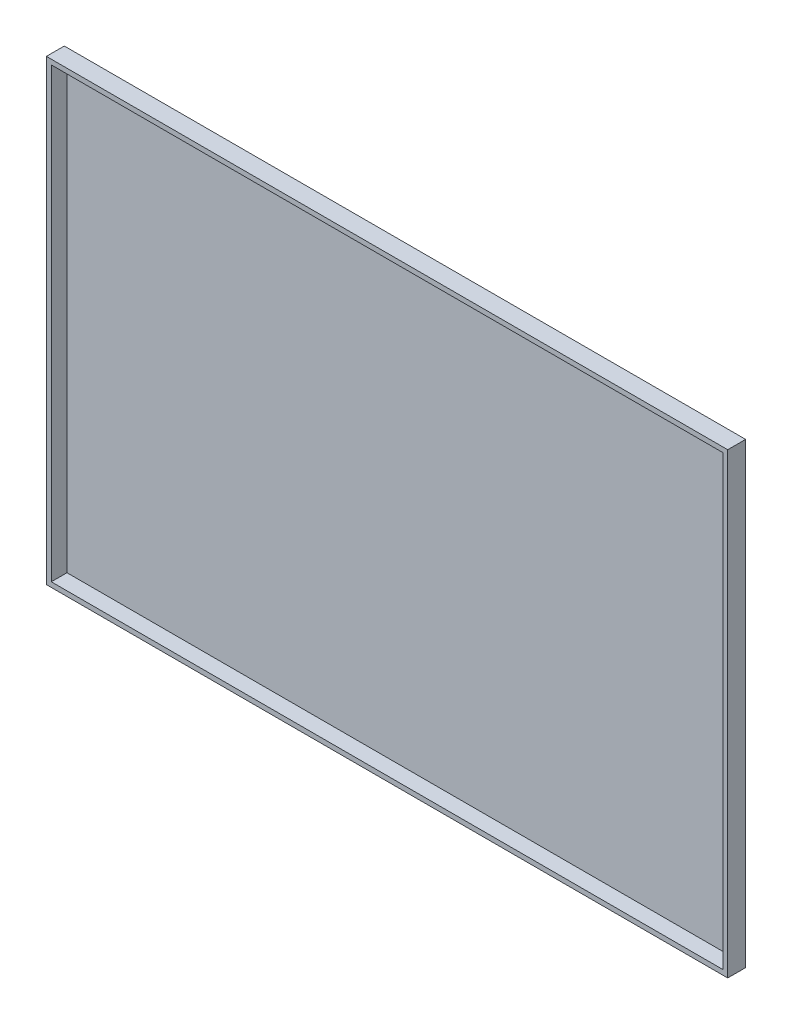
ISO-10303-21;
HEADER;
FILE_DESCRIPTION(('STEP AP214'),'2;1');
FILE_NAME('part.step','',(''),(''),'','','');
FILE_SCHEMA(('AUTOMOTIVE_DESIGN { 1 0 10303 214 1 1 1 1 }'));
ENDSEC;
DATA;
#1=APPLICATION_CONTEXT('core data for automotive mechanical design processes');
#2=APPLICATION_PROTOCOL_DEFINITION('international standard','automotive_design',2000,#1);
#3=PRODUCT_CONTEXT('',#1,'mechanical');
#4=PRODUCT('Part','Part','',(#3));
#5=PRODUCT_RELATED_PRODUCT_CATEGORY('part','',(#4));
#6=PRODUCT_DEFINITION_FORMATION('','',#4);
#7=PRODUCT_DEFINITION_CONTEXT('part definition',#1,'design');
#8=PRODUCT_DEFINITION('design','',#6,#7);
#9=PRODUCT_DEFINITION_SHAPE('','',#8);
#10=(LENGTH_UNIT() NAMED_UNIT(*) SI_UNIT(.MILLI.,.METRE.));
#11=(NAMED_UNIT(*) PLANE_ANGLE_UNIT() SI_UNIT($,.RADIAN.));
#12=(NAMED_UNIT(*) SI_UNIT($,.STERADIAN.) SOLID_ANGLE_UNIT());
#13=UNCERTAINTY_MEASURE_WITH_UNIT(LENGTH_MEASURE(1.E-05),#10,'distance_accuracy_value','');
#14=(GEOMETRIC_REPRESENTATION_CONTEXT(3) GLOBAL_UNCERTAINTY_ASSIGNED_CONTEXT((#13)) GLOBAL_UNIT_ASSIGNED_CONTEXT((#10,
#11,#12)) REPRESENTATION_CONTEXT('',''));
#15=CARTESIAN_POINT('',(0.,0.,0.));
#16=DIRECTION('',(0.,0.,1.));
#17=DIRECTION('',(1.,0.,0.));
#18=AXIS2_PLACEMENT_3D('',#15,#16,#17);
#19=CARTESIAN_POINT('',(1522.,0.,10.));
#20=DIRECTION('',(1.,0.,0.));
#21=DIRECTION('',(0.,0.,-1.));
#22=AXIS2_PLACEMENT_3D('',#19,#20,#21);
#23=PLANE('',#22);
#24=DIRECTION('',(0.,-1.,0.));
#25=VECTOR('',#24,1.);
#26=CARTESIAN_POINT('',(1522.,0.,0.));
#27=LINE('',#26,#25);
#28=CARTESIAN_POINT('',(1522.,1022.,0.));
#29=VERTEX_POINT('',#28);
#30=CARTESIAN_POINT('',(1522.,-1022.,0.));
#31=VERTEX_POINT('',#30);
#32=EDGE_CURVE('E173',#29,#31,#27,.T.);
#33=ORIENTED_EDGE('',*,*,#32,.F.);
#34=DIRECTION('',(0.,0.,-1.));
#35=VECTOR('',#34,1.);
#36=CARTESIAN_POINT('',(1522.,1022.,10.));
#37=LINE('',#36,#35);
#38=CARTESIAN_POINT('',(1522.,1022.,80.));
#39=VERTEX_POINT('',#38);
#40=EDGE_CURVE('E11',#39,#29,#37,.T.);
#41=ORIENTED_EDGE('',*,*,#40,.F.);
#42=DIRECTION('',(0.,1.,0.));
#43=VECTOR('',#42,1.);
#44=CARTESIAN_POINT('',(1522.,1022.,80.));
#45=LINE('',#44,#43);
#46=CARTESIAN_POINT('',(1522.,-1022.,80.));
#47=VERTEX_POINT('',#46);
#48=EDGE_CURVE('E124',#47,#39,#45,.T.);
#49=ORIENTED_EDGE('',*,*,#48,.F.);
#50=DIRECTION('',(0.,0.,-1.));
#51=VECTOR('',#50,1.);
#52=CARTESIAN_POINT('',(1522.,-1022.,10.));
#53=LINE('',#52,#51);
#54=EDGE_CURVE('E188',#47,#31,#53,.T.);
#55=ORIENTED_EDGE('',*,*,#54,.T.);
#56=EDGE_LOOP('',(#33,#41,#49,#55));
#57=FACE_BOUND('',#56,.T.);
#58=ADVANCED_FACE('F44',(#57),#23,.T.);
#59=CARTESIAN_POINT('',(0.,1022.,10.));
#60=DIRECTION('',(0.,1.,0.));
#61=DIRECTION('',(0.,0.,1.));
#62=AXIS2_PLACEMENT_3D('',#59,#60,#61);
#63=PLANE('',#62);
#64=DIRECTION('',(1.,0.,0.));
#65=VECTOR('',#64,1.);
#66=CARTESIAN_POINT('',(0.,1022.,0.));
#67=LINE('',#66,#65);
#68=CARTESIAN_POINT('',(-1522.,1022.,0.));
#69=VERTEX_POINT('',#68);
#70=EDGE_CURVE('E177',#69,#29,#67,.T.);
#71=ORIENTED_EDGE('',*,*,#70,.F.);
#72=DIRECTION('',(0.,0.,-1.));
#73=VECTOR('',#72,1.);
#74=CARTESIAN_POINT('',(-1522.,1022.,10.));
#75=LINE('',#74,#73);
#76=CARTESIAN_POINT('',(-1522.,1022.,80.));
#77=VERTEX_POINT('',#76);
#78=EDGE_CURVE('E52',#77,#69,#75,.T.);
#79=ORIENTED_EDGE('',*,*,#78,.F.);
#80=DIRECTION('',(-1.,0.,0.));
#81=VECTOR('',#80,1.);
#82=CARTESIAN_POINT('',(-1522.,1022.,80.));
#83=LINE('',#82,#81);
#84=EDGE_CURVE('E150',#39,#77,#83,.T.);
#85=ORIENTED_EDGE('',*,*,#84,.F.);
#86=ORIENTED_EDGE('',*,*,#40,.T.);
#87=EDGE_LOOP('',(#71,#79,#85,#86));
#88=FACE_BOUND('',#87,.T.);
#89=ADVANCED_FACE('F205',(#88),#63,.T.);
#90=CARTESIAN_POINT('',(-1522.,0.,10.));
#91=DIRECTION('',(1.,0.,0.));
#92=DIRECTION('',(0.,0.,-1.));
#93=AXIS2_PLACEMENT_3D('',#90,#91,#92);
#94=PLANE('',#93);
#95=DIRECTION('',(0.,-1.,0.));
#96=VECTOR('',#95,1.);
#97=CARTESIAN_POINT('',(-1522.,0.,0.));
#98=LINE('',#97,#96);
#99=CARTESIAN_POINT('',(-1522.,-1022.,0.));
#100=VERTEX_POINT('',#99);
#101=EDGE_CURVE('E181',#69,#100,#98,.T.);
#102=ORIENTED_EDGE('',*,*,#101,.T.);
#103=DIRECTION('',(0.,0.,-1.));
#104=VECTOR('',#103,1.);
#105=CARTESIAN_POINT('',(-1522.,-1022.,10.));
#106=LINE('',#105,#104);
#107=CARTESIAN_POINT('',(-1522.,-1022.,80.));
#108=VERTEX_POINT('',#107);
#109=EDGE_CURVE('E191',#108,#100,#106,.T.);
#110=ORIENTED_EDGE('',*,*,#109,.F.);
#111=DIRECTION('',(0.,-1.,0.));
#112=VECTOR('',#111,1.);
#113=CARTESIAN_POINT('',(-1522.,1022.,80.));
#114=LINE('',#113,#112);
#115=EDGE_CURVE('E154',#77,#108,#114,.T.);
#116=ORIENTED_EDGE('',*,*,#115,.F.);
#117=ORIENTED_EDGE('',*,*,#78,.T.);
#118=EDGE_LOOP('',(#102,#110,#116,#117));
#119=FACE_BOUND('',#118,.T.);
#120=ADVANCED_FACE('F198',(#119),#94,.F.);
#121=CARTESIAN_POINT('',(0.,-1022.,10.));
#122=DIRECTION('',(0.,1.,0.));
#123=DIRECTION('',(0.,0.,1.));
#124=AXIS2_PLACEMENT_3D('',#121,#122,#123);
#125=PLANE('',#124);
#126=DIRECTION('',(1.,0.,0.));
#127=VECTOR('',#126,1.);
#128=CARTESIAN_POINT('',(0.,-1022.,0.));
#129=LINE('',#128,#127);
#130=EDGE_CURVE('E184',#100,#31,#129,.T.);
#131=ORIENTED_EDGE('',*,*,#130,.T.);
#132=ORIENTED_EDGE('',*,*,#54,.F.);
#133=DIRECTION('',(1.,0.,0.));
#134=VECTOR('',#133,1.);
#135=CARTESIAN_POINT('',(-1522.,-1022.,80.));
#136=LINE('',#135,#134);
#137=EDGE_CURVE('E158',#108,#47,#136,.T.);
#138=ORIENTED_EDGE('',*,*,#137,.F.);
#139=ORIENTED_EDGE('',*,*,#109,.T.);
#140=EDGE_LOOP('',(#131,#132,#138,#139));
#141=FACE_BOUND('',#140,.T.);
#142=ADVANCED_FACE('F211',(#141),#125,.F.);
#143=CARTESIAN_POINT('',(0.,0.,0.));
#144=DIRECTION('',(0.,0.,1.));
#145=DIRECTION('',(1.,0.,0.));
#146=AXIS2_PLACEMENT_3D('',#143,#144,#145);
#147=PLANE('',#146);
#148=ORIENTED_EDGE('',*,*,#32,.T.);
#149=ORIENTED_EDGE('',*,*,#130,.F.);
#150=ORIENTED_EDGE('',*,*,#101,.F.);
#151=ORIENTED_EDGE('',*,*,#70,.T.);
#152=EDGE_LOOP('',(#148,#149,#150,#151));
#153=FACE_BOUND('',#152,.T.);
#154=ADVANCED_FACE('F204',(#153),#147,.F.);
#155=CARTESIAN_POINT('',(0.,0.,80.));
#156=DIRECTION('',(0.,0.,1.));
#157=DIRECTION('',(1.,0.,0.));
#158=AXIS2_PLACEMENT_3D('',#155,#156,#157);
#159=PLANE('',#158);
#160=ORIENTED_EDGE('',*,*,#48,.T.);
#161=ORIENTED_EDGE('',*,*,#84,.T.);
#162=ORIENTED_EDGE('',*,*,#115,.T.);
#163=ORIENTED_EDGE('',*,*,#137,.T.);
#164=EDGE_LOOP('',(#160,#161,#162,#163));
#165=FACE_BOUND('',#164,.T.);
#166=DIRECTION('',(-1.,0.,0.));
#167=VECTOR('',#166,1.);
#168=CARTESIAN_POINT('',(-1500.,1000.,80.));
#169=LINE('',#168,#167);
#170=CARTESIAN_POINT('',(1500.,1000.,80.));
#171=VERTEX_POINT('',#170);
#172=CARTESIAN_POINT('',(-1500.,1000.,80.));
#173=VERTEX_POINT('',#172);
#174=EDGE_CURVE('E117',#171,#173,#169,.T.);
#175=ORIENTED_EDGE('',*,*,#174,.F.);
#176=DIRECTION('',(0.,1.,0.));
#177=VECTOR('',#176,1.);
#178=CARTESIAN_POINT('',(1500.,1000.,80.));
#179=LINE('',#178,#177);
#180=CARTESIAN_POINT('',(1500.,-1000.,80.));
#181=VERTEX_POINT('',#180);
#182=EDGE_CURVE('E107',#181,#171,#179,.T.);
#183=ORIENTED_EDGE('',*,*,#182,.F.);
#184=DIRECTION('',(1.,0.,0.));
#185=VECTOR('',#184,1.);
#186=CARTESIAN_POINT('',(-1500.,-1000.,80.));
#187=LINE('',#186,#185);
#188=CARTESIAN_POINT('',(-1500.,-1000.,80.));
#189=VERTEX_POINT('',#188);
#190=EDGE_CURVE('E134',#189,#181,#187,.T.);
#191=ORIENTED_EDGE('',*,*,#190,.F.);
#192=DIRECTION('',(0.,-1.,0.));
#193=VECTOR('',#192,1.);
#194=CARTESIAN_POINT('',(-1500.,1000.,80.));
#195=LINE('',#194,#193);
#196=EDGE_CURVE('E130',#173,#189,#195,.T.);
#197=ORIENTED_EDGE('',*,*,#196,.F.);
#198=EDGE_LOOP('',(#175,#183,#191,#197));
#199=FACE_BOUND('',#198,.T.);
#200=ADVANCED_FACE('F128',(#165,#199),#159,.T.);
#201=CARTESIAN_POINT('',(1500.,1000.,80.));
#202=DIRECTION('',(-1.,0.,0.));
#203=DIRECTION('',(0.,-1.,0.));
#204=AXIS2_PLACEMENT_3D('',#201,#202,#203);
#205=PLANE('',#204);
#206=DIRECTION('',(0.,0.,-1.));
#207=VECTOR('',#206,1.);
#208=CARTESIAN_POINT('',(1500.,1000.,80.));
#209=LINE('',#208,#207);
#210=CARTESIAN_POINT('',(1500.,1000.,10.));
#211=VERTEX_POINT('',#210);
#212=EDGE_CURVE('E110',#171,#211,#209,.T.);
#213=ORIENTED_EDGE('',*,*,#212,.T.);
#214=DIRECTION('',(0.,-1.,0.));
#215=VECTOR('',#214,1.);
#216=CARTESIAN_POINT('',(1500.,6.66133814775094E-13,10.));
#217=LINE('',#216,#215);
#218=CARTESIAN_POINT('',(1500.,-1000.,10.));
#219=VERTEX_POINT('',#218);
#220=EDGE_CURVE('E59',#211,#219,#217,.T.);
#221=ORIENTED_EDGE('',*,*,#220,.T.);
#222=DIRECTION('',(0.,0.,-1.));
#223=VECTOR('',#222,1.);
#224=CARTESIAN_POINT('',(1500.,-1000.,80.));
#225=LINE('',#224,#223);
#226=EDGE_CURVE('E112',#181,#219,#225,.T.);
#227=ORIENTED_EDGE('',*,*,#226,.F.);
#228=ORIENTED_EDGE('',*,*,#182,.T.);
#229=EDGE_LOOP('',(#213,#221,#227,#228));
#230=FACE_BOUND('',#229,.T.);
#231=ADVANCED_FACE('F109',(#230),#205,.T.);
#232=CARTESIAN_POINT('',(-1500.,1000.,80.));
#233=DIRECTION('',(0.,-1.,0.));
#234=DIRECTION('',(0.,0.,-1.));
#235=AXIS2_PLACEMENT_3D('',#232,#233,#234);
#236=PLANE('',#235);
#237=DIRECTION('',(0.,0.,-1.));
#238=VECTOR('',#237,1.);
#239=CARTESIAN_POINT('',(-1500.,1000.,80.));
#240=LINE('',#239,#238);
#241=CARTESIAN_POINT('',(-1500.,999.999999999999,10.));
#242=VERTEX_POINT('',#241);
#243=EDGE_CURVE('E125',#173,#242,#240,.T.);
#244=ORIENTED_EDGE('',*,*,#243,.T.);
#245=DIRECTION('',(1.,0.,0.));
#246=VECTOR('',#245,1.);
#247=CARTESIAN_POINT('',(0.,1000.,10.));
#248=LINE('',#247,#246);
#249=EDGE_CURVE('E63',#242,#211,#248,.T.);
#250=ORIENTED_EDGE('',*,*,#249,.T.);
#251=ORIENTED_EDGE('',*,*,#212,.F.);
#252=ORIENTED_EDGE('',*,*,#174,.T.);
#253=EDGE_LOOP('',(#244,#250,#251,#252));
#254=FACE_BOUND('',#253,.T.);
#255=ADVANCED_FACE('F121',(#254),#236,.T.);
#256=CARTESIAN_POINT('',(-1500.,1000.,80.));
#257=DIRECTION('',(1.,0.,0.));
#258=DIRECTION('',(0.,1.,0.));
#259=AXIS2_PLACEMENT_3D('',#256,#257,#258);
#260=PLANE('',#259);
#261=DIRECTION('',(0.,0.,-1.));
#262=VECTOR('',#261,1.);
#263=CARTESIAN_POINT('',(-1500.,-1000.,80.));
#264=LINE('',#263,#262);
#265=CARTESIAN_POINT('',(-1500.,-1000.,9.99999999999999));
#266=VERTEX_POINT('',#265);
#267=EDGE_CURVE('E141',#189,#266,#264,.T.);
#268=ORIENTED_EDGE('',*,*,#267,.T.);
#269=DIRECTION('',(0.,1.,0.));
#270=VECTOR('',#269,1.);
#271=CARTESIAN_POINT('',(-1500.,-3.33066907387547E-13,10.));
#272=LINE('',#271,#270);
#273=EDGE_CURVE('E166',#266,#242,#272,.T.);
#274=ORIENTED_EDGE('',*,*,#273,.T.);
#275=ORIENTED_EDGE('',*,*,#243,.F.);
#276=ORIENTED_EDGE('',*,*,#196,.T.);
#277=EDGE_LOOP('',(#268,#274,#275,#276));
#278=FACE_BOUND('',#277,.T.);
#279=ADVANCED_FACE('F238',(#278),#260,.T.);
#280=CARTESIAN_POINT('',(-1500.,-1000.,80.));
#281=DIRECTION('',(0.,1.,0.));
#282=DIRECTION('',(0.,0.,1.));
#283=AXIS2_PLACEMENT_3D('',#280,#281,#282);
#284=PLANE('',#283);
#285=ORIENTED_EDGE('',*,*,#226,.T.);
#286=DIRECTION('',(-1.,0.,0.));
#287=VECTOR('',#286,1.);
#288=CARTESIAN_POINT('',(0.,-1000.,10.));
#289=LINE('',#288,#287);
#290=EDGE_CURVE('E162',#219,#266,#289,.T.);
#291=ORIENTED_EDGE('',*,*,#290,.T.);
#292=ORIENTED_EDGE('',*,*,#267,.F.);
#293=ORIENTED_EDGE('',*,*,#190,.T.);
#294=EDGE_LOOP('',(#285,#291,#292,#293));
#295=FACE_BOUND('',#294,.T.);
#296=ADVANCED_FACE('F234',(#295),#284,.T.);
#297=CARTESIAN_POINT('',(0.,0.,10.));
#298=DIRECTION('',(0.,0.,1.));
#299=DIRECTION('',(1.,0.,0.));
#300=AXIS2_PLACEMENT_3D('',#297,#298,#299);
#301=PLANE('',#300);
#302=ORIENTED_EDGE('',*,*,#220,.F.);
#303=ORIENTED_EDGE('',*,*,#249,.F.);
#304=ORIENTED_EDGE('',*,*,#273,.F.);
#305=ORIENTED_EDGE('',*,*,#290,.F.);
#306=EDGE_LOOP('',(#302,#303,#304,#305));
#307=FACE_BOUND('',#306,.T.);
#308=ADVANCED_FACE('F232',(#307),#301,.T.);
#309=CLOSED_SHELL('',(#58,#89,#120,#142,#154,#200,#231,#255,#279,#296,#308));
#310=MANIFOLD_SOLID_BREP('B2',#309);
#311=ADVANCED_BREP_SHAPE_REPRESENTATION('',(#18,#310),#14);
#312=SHAPE_DEFINITION_REPRESENTATION(#9,#311);
ENDSEC;
END-ISO-10303-21;
